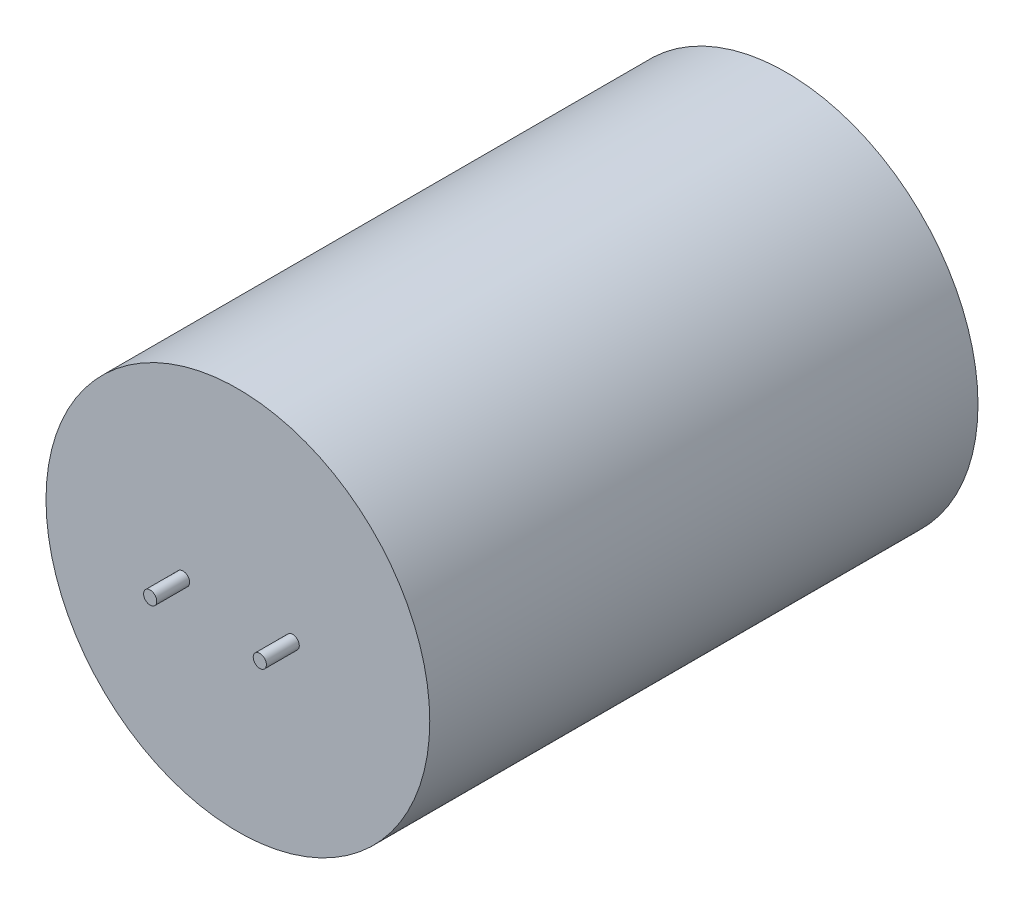
ISO-10303-21;
HEADER;
FILE_DESCRIPTION(('STEP AP214'),'2;1');
FILE_NAME('part.step','',(''),(''),'','','');
FILE_SCHEMA(('AUTOMOTIVE_DESIGN { 1 0 10303 214 1 1 1 1 }'));
ENDSEC;
DATA;
#1=APPLICATION_CONTEXT('core data for automotive mechanical design processes');
#2=APPLICATION_PROTOCOL_DEFINITION('international standard','automotive_design',2000,#1);
#3=PRODUCT_CONTEXT('',#1,'mechanical');
#4=PRODUCT('Part','Part','',(#3));
#5=PRODUCT_RELATED_PRODUCT_CATEGORY('part','',(#4));
#6=PRODUCT_DEFINITION_FORMATION('','',#4);
#7=PRODUCT_DEFINITION_CONTEXT('part definition',#1,'design');
#8=PRODUCT_DEFINITION('design','',#6,#7);
#9=PRODUCT_DEFINITION_SHAPE('','',#8);
#10=(LENGTH_UNIT() NAMED_UNIT(*) SI_UNIT(.MILLI.,.METRE.));
#11=(NAMED_UNIT(*) PLANE_ANGLE_UNIT() SI_UNIT($,.RADIAN.));
#12=(NAMED_UNIT(*) SI_UNIT($,.STERADIAN.) SOLID_ANGLE_UNIT());
#13=UNCERTAINTY_MEASURE_WITH_UNIT(LENGTH_MEASURE(1.E-05),#10,'distance_accuracy_value','');
#14=(GEOMETRIC_REPRESENTATION_CONTEXT(3) GLOBAL_UNCERTAINTY_ASSIGNED_CONTEXT((#13)) GLOBAL_UNIT_ASSIGNED_CONTEXT((#10,
#11,#12)) REPRESENTATION_CONTEXT('',''));
#15=CARTESIAN_POINT('',(0.,0.,0.));
#16=DIRECTION('',(0.,0.,1.));
#17=DIRECTION('',(1.,0.,0.));
#18=AXIS2_PLACEMENT_3D('',#15,#16,#17);
#19=CARTESIAN_POINT('',(0.,0.,50.));
#20=DIRECTION('',(0.,0.,1.));
#21=DIRECTION('',(1.,0.,0.));
#22=AXIS2_PLACEMENT_3D('',#19,#20,#21);
#23=PLANE('',#22);
#24=CARTESIAN_POINT('',(-5.,0.,50.));
#25=DIRECTION('',(0.,0.,1.));
#26=DIRECTION('',(1.,0.,0.));
#27=AXIS2_PLACEMENT_3D('',#24,#25,#26);
#28=CIRCLE('',#27,0.6);
#29=CARTESIAN_POINT('',(-4.4,0.,50.));
#30=VERTEX_POINT('',#29);
#31=EDGE_CURVE('E42',#30,#30,#28,.T.);
#32=ORIENTED_EDGE('',*,*,#31,.F.);
#33=EDGE_LOOP('',(#32));
#34=FACE_BOUND('',#33,.T.);
#35=CARTESIAN_POINT('',(0.,0.,50.));
#36=DIRECTION('',(0.,0.,1.));
#37=DIRECTION('',(1.,0.,0.));
#38=AXIS2_PLACEMENT_3D('',#35,#36,#37);
#39=CIRCLE('',#38,17.5);
#40=CARTESIAN_POINT('',(17.5,0.,50.));
#41=VERTEX_POINT('',#40);
#42=EDGE_CURVE('E10',#41,#41,#39,.T.);
#43=ORIENTED_EDGE('',*,*,#42,.T.);
#44=EDGE_LOOP('',(#43));
#45=FACE_BOUND('',#44,.T.);
#46=CARTESIAN_POINT('',(5.,0.,50.));
#47=DIRECTION('',(0.,0.,1.));
#48=DIRECTION('',(1.,0.,0.));
#49=AXIS2_PLACEMENT_3D('',#46,#47,#48);
#50=CIRCLE('',#49,0.6);
#51=CARTESIAN_POINT('',(5.6,0.,50.));
#52=VERTEX_POINT('',#51);
#53=EDGE_CURVE('E48',#52,#52,#50,.T.);
#54=ORIENTED_EDGE('',*,*,#53,.F.);
#55=EDGE_LOOP('',(#54));
#56=FACE_BOUND('',#55,.T.);
#57=ADVANCED_FACE('F29',(#34,#45,#56),#23,.T.);
#58=CARTESIAN_POINT('',(0.,0.,50.));
#59=DIRECTION('',(0.,0.,-1.));
#60=DIRECTION('',(-1.,0.,0.));
#61=AXIS2_PLACEMENT_3D('',#58,#59,#60);
#62=CYLINDRICAL_SURFACE('',#61,17.5);
#63=ORIENTED_EDGE('',*,*,#42,.F.);
#64=EDGE_LOOP('',(#63));
#65=FACE_BOUND('',#64,.T.);
#66=CARTESIAN_POINT('',(0.,0.,0.));
#67=DIRECTION('',(0.,0.,1.));
#68=DIRECTION('',(1.,0.,0.));
#69=AXIS2_PLACEMENT_3D('',#66,#67,#68);
#70=CIRCLE('',#69,17.5);
#71=CARTESIAN_POINT('',(17.5,0.,0.));
#72=VERTEX_POINT('',#71);
#73=EDGE_CURVE('E33',#72,#72,#70,.T.);
#74=ORIENTED_EDGE('',*,*,#73,.T.);
#75=EDGE_LOOP('',(#74));
#76=FACE_BOUND('',#75,.T.);
#77=ADVANCED_FACE('F31',(#65,#76),#62,.T.);
#78=CARTESIAN_POINT('',(0.,0.,0.));
#79=DIRECTION('',(0.,0.,1.));
#80=DIRECTION('',(1.,0.,0.));
#81=AXIS2_PLACEMENT_3D('',#78,#79,#80);
#82=PLANE('',#81);
#83=ORIENTED_EDGE('',*,*,#73,.F.);
#84=EDGE_LOOP('',(#83));
#85=FACE_BOUND('',#84,.T.);
#86=ADVANCED_FACE('F69',(#85),#82,.F.);
#87=CARTESIAN_POINT('',(-5.,0.,53.));
#88=DIRECTION('',(0.,0.,-1.));
#89=DIRECTION('',(-1.,0.,0.));
#90=AXIS2_PLACEMENT_3D('',#87,#88,#89);
#91=CYLINDRICAL_SURFACE('',#90,0.6);
#92=CARTESIAN_POINT('',(-5.,0.,53.));
#93=DIRECTION('',(0.,0.,1.));
#94=DIRECTION('',(1.,0.,0.));
#95=AXIS2_PLACEMENT_3D('',#92,#93,#94);
#96=CIRCLE('',#95,0.6);
#97=CARTESIAN_POINT('',(-4.4,0.,53.));
#98=VERTEX_POINT('',#97);
#99=EDGE_CURVE('E40',#98,#98,#96,.T.);
#100=ORIENTED_EDGE('',*,*,#99,.F.);
#101=EDGE_LOOP('',(#100));
#102=FACE_BOUND('',#101,.T.);
#103=ORIENTED_EDGE('',*,*,#31,.T.);
#104=EDGE_LOOP('',(#103));
#105=FACE_BOUND('',#104,.T.);
#106=ADVANCED_FACE('F73',(#102,#105),#91,.T.);
#107=CARTESIAN_POINT('',(-5.,0.,53.));
#108=DIRECTION('',(0.,0.,1.));
#109=DIRECTION('',(1.,0.,0.));
#110=AXIS2_PLACEMENT_3D('',#107,#108,#109);
#111=PLANE('',#110);
#112=ORIENTED_EDGE('',*,*,#99,.T.);
#113=EDGE_LOOP('',(#112));
#114=FACE_BOUND('',#113,.T.);
#115=ADVANCED_FACE('F59',(#114),#111,.T.);
#116=CARTESIAN_POINT('',(5.,0.,53.));
#117=DIRECTION('',(0.,0.,-1.));
#118=DIRECTION('',(-1.,0.,0.));
#119=AXIS2_PLACEMENT_3D('',#116,#117,#118);
#120=CYLINDRICAL_SURFACE('',#119,0.6);
#121=CARTESIAN_POINT('',(5.,0.,53.));
#122=DIRECTION('',(0.,0.,1.));
#123=DIRECTION('',(1.,0.,0.));
#124=AXIS2_PLACEMENT_3D('',#121,#122,#123);
#125=CIRCLE('',#124,0.6);
#126=CARTESIAN_POINT('',(5.6,0.,53.));
#127=VERTEX_POINT('',#126);
#128=EDGE_CURVE('E45',#127,#127,#125,.T.);
#129=ORIENTED_EDGE('',*,*,#128,.F.);
#130=EDGE_LOOP('',(#129));
#131=FACE_BOUND('',#130,.T.);
#132=ORIENTED_EDGE('',*,*,#53,.T.);
#133=EDGE_LOOP('',(#132));
#134=FACE_BOUND('',#133,.T.);
#135=ADVANCED_FACE('F56',(#131,#134),#120,.T.);
#136=CARTESIAN_POINT('',(5.,0.,53.));
#137=DIRECTION('',(0.,0.,1.));
#138=DIRECTION('',(1.,0.,0.));
#139=AXIS2_PLACEMENT_3D('',#136,#137,#138);
#140=PLANE('',#139);
#141=ORIENTED_EDGE('',*,*,#128,.T.);
#142=EDGE_LOOP('',(#141));
#143=FACE_BOUND('',#142,.T.);
#144=ADVANCED_FACE('F54',(#143),#140,.T.);
#145=CLOSED_SHELL('',(#57,#77,#86,#106,#115,#135,#144));
#146=MANIFOLD_SOLID_BREP('B2',#145);
#147=ADVANCED_BREP_SHAPE_REPRESENTATION('',(#18,#146),#14);
#148=SHAPE_DEFINITION_REPRESENTATION(#9,#147);
ENDSEC;
END-ISO-10303-21;
